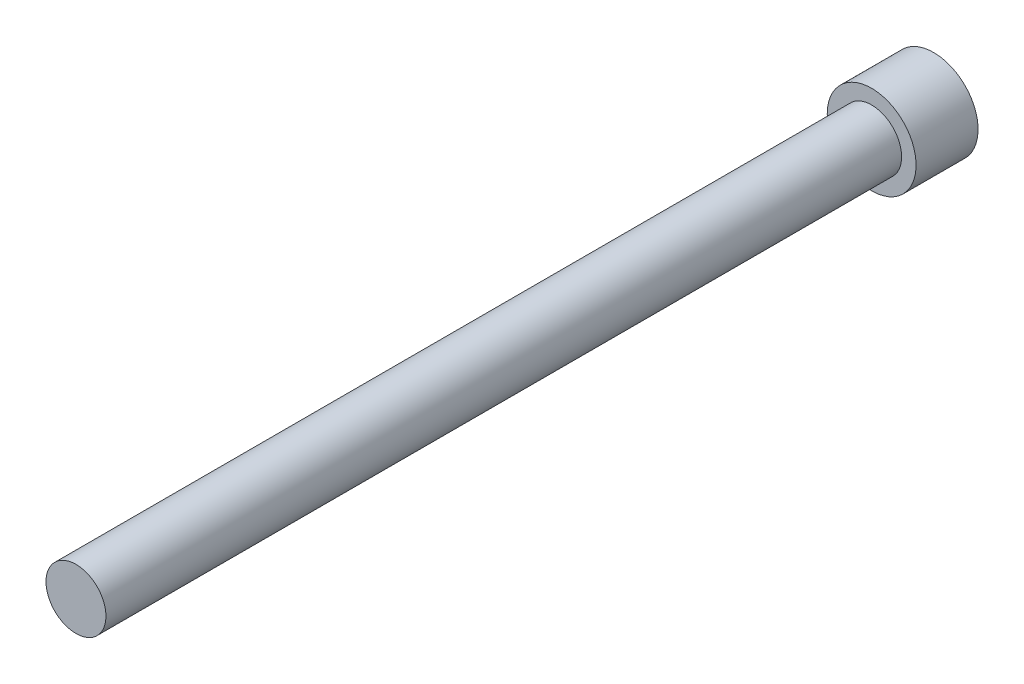
ISO-10303-21;
HEADER;
FILE_DESCRIPTION(('STEP AP214'),'2;1');
FILE_NAME('part.step','',(''),(''),'','','');
FILE_SCHEMA(('AUTOMOTIVE_DESIGN { 1 0 10303 214 1 1 1 1 }'));
ENDSEC;
DATA;
#1=APPLICATION_CONTEXT('core data for automotive mechanical design processes');
#2=APPLICATION_PROTOCOL_DEFINITION('international standard','automotive_design',2000,#1);
#3=PRODUCT_CONTEXT('',#1,'mechanical');
#4=PRODUCT('Part','Part','',(#3));
#5=PRODUCT_RELATED_PRODUCT_CATEGORY('part','',(#4));
#6=PRODUCT_DEFINITION_FORMATION('','',#4);
#7=PRODUCT_DEFINITION_CONTEXT('part definition',#1,'design');
#8=PRODUCT_DEFINITION('design','',#6,#7);
#9=PRODUCT_DEFINITION_SHAPE('','',#8);
#10=(LENGTH_UNIT() NAMED_UNIT(*) SI_UNIT(.MILLI.,.METRE.));
#11=(NAMED_UNIT(*) PLANE_ANGLE_UNIT() SI_UNIT($,.RADIAN.));
#12=(NAMED_UNIT(*) SI_UNIT($,.STERADIAN.) SOLID_ANGLE_UNIT());
#13=UNCERTAINTY_MEASURE_WITH_UNIT(LENGTH_MEASURE(1.E-05),#10,'distance_accuracy_value','');
#14=(GEOMETRIC_REPRESENTATION_CONTEXT(3) GLOBAL_UNCERTAINTY_ASSIGNED_CONTEXT((#13)) GLOBAL_UNIT_ASSIGNED_CONTEXT((#10,
#11,#12)) REPRESENTATION_CONTEXT('',''));
#15=CARTESIAN_POINT('',(0.,0.,0.));
#16=DIRECTION('',(0.,0.,1.));
#17=DIRECTION('',(1.,0.,0.));
#18=AXIS2_PLACEMENT_3D('',#15,#16,#17);
#19=CARTESIAN_POINT('',(0.,0.,41.5));
#20=DIRECTION('',(0.,0.,-1.));
#21=DIRECTION('',(-1.,0.,0.));
#22=AXIS2_PLACEMENT_3D('',#19,#20,#21);
#23=CYLINDRICAL_SURFACE('',#22,1.45);
#24=CARTESIAN_POINT('',(0.,0.,41.5));
#25=DIRECTION('',(0.,0.,1.));
#26=DIRECTION('',(1.,0.,0.));
#27=AXIS2_PLACEMENT_3D('',#24,#25,#26);
#28=CIRCLE('',#27,1.45);
#29=CARTESIAN_POINT('',(1.45,0.,41.5));
#30=VERTEX_POINT('',#29);
#31=EDGE_CURVE('E48',#30,#30,#28,.T.);
#32=ORIENTED_EDGE('',*,*,#31,.F.);
#33=EDGE_LOOP('',(#32));
#34=FACE_BOUND('',#33,.T.);
#35=CARTESIAN_POINT('',(0.,0.,3.));
#36=DIRECTION('',(0.,0.,-1.));
#37=DIRECTION('',(-1.,0.,0.));
#38=AXIS2_PLACEMENT_3D('',#35,#36,#37);
#39=CIRCLE('',#38,1.45);
#40=CARTESIAN_POINT('',(-1.45,0.,3.));
#41=VERTEX_POINT('',#40);
#42=EDGE_CURVE('E10',#41,#41,#39,.T.);
#43=ORIENTED_EDGE('',*,*,#42,.F.);
#44=EDGE_LOOP('',(#43));
#45=FACE_BOUND('',#44,.T.);
#46=ADVANCED_FACE('F41',(#34,#45),#23,.T.);
#47=CARTESIAN_POINT('',(0.,0.,41.5));
#48=DIRECTION('',(0.,0.,1.));
#49=DIRECTION('',(1.,0.,0.));
#50=AXIS2_PLACEMENT_3D('',#47,#48,#49);
#51=PLANE('',#50);
#52=ORIENTED_EDGE('',*,*,#31,.T.);
#53=EDGE_LOOP('',(#52));
#54=FACE_BOUND('',#53,.T.);
#55=ADVANCED_FACE('F70',(#54),#51,.T.);
#56=CARTESIAN_POINT('',(0.,0.,3.));
#57=DIRECTION('',(0.,0.,-1.));
#58=DIRECTION('',(-1.,0.,0.));
#59=AXIS2_PLACEMENT_3D('',#56,#57,#58);
#60=CYLINDRICAL_SURFACE('',#59,2.15);
#61=CARTESIAN_POINT('',(0.,0.,3.));
#62=DIRECTION('',(0.,0.,-1.));
#63=DIRECTION('',(-1.,0.,0.));
#64=AXIS2_PLACEMENT_3D('',#61,#62,#63);
#65=CIRCLE('',#64,2.15);
#66=CARTESIAN_POINT('',(-2.15,0.,3.));
#67=VERTEX_POINT('',#66);
#68=EDGE_CURVE('E53',#67,#67,#65,.T.);
#69=ORIENTED_EDGE('',*,*,#68,.T.);
#70=EDGE_LOOP('',(#69));
#71=FACE_BOUND('',#70,.T.);
#72=CARTESIAN_POINT('',(0.,0.,0.));
#73=DIRECTION('',(0.,0.,-1.));
#74=DIRECTION('',(-1.,0.,0.));
#75=AXIS2_PLACEMENT_3D('',#72,#73,#74);
#76=CIRCLE('',#75,2.15);
#77=CARTESIAN_POINT('',(-2.15,0.,0.));
#78=VERTEX_POINT('',#77);
#79=EDGE_CURVE('E58',#78,#78,#76,.T.);
#80=ORIENTED_EDGE('',*,*,#79,.F.);
#81=EDGE_LOOP('',(#80));
#82=FACE_BOUND('',#81,.T.);
#83=ADVANCED_FACE('F67',(#71,#82),#60,.T.);
#84=CARTESIAN_POINT('',(0.,0.,3.));
#85=DIRECTION('',(0.,0.,-1.));
#86=DIRECTION('',(-1.,0.,0.));
#87=AXIS2_PLACEMENT_3D('',#84,#85,#86);
#88=PLANE('',#87);
#89=ORIENTED_EDGE('',*,*,#42,.T.);
#90=EDGE_LOOP('',(#89));
#91=FACE_BOUND('',#90,.T.);
#92=ORIENTED_EDGE('',*,*,#68,.F.);
#93=EDGE_LOOP('',(#92));
#94=FACE_BOUND('',#93,.T.);
#95=ADVANCED_FACE('F69',(#91,#94),#88,.F.);
#96=CARTESIAN_POINT('',(0.,0.,0.));
#97=DIRECTION('',(0.,0.,1.));
#98=DIRECTION('',(1.,0.,0.));
#99=AXIS2_PLACEMENT_3D('',#96,#97,#98);
#100=PLANE('',#99);
#101=ORIENTED_EDGE('',*,*,#79,.T.);
#102=EDGE_LOOP('',(#101));
#103=FACE_BOUND('',#102,.T.);
#104=ADVANCED_FACE('F65',(#103),#100,.F.);
#105=CLOSED_SHELL('',(#46,#55,#83,#95,#104));
#106=MANIFOLD_SOLID_BREP('B2',#105);
#107=ADVANCED_BREP_SHAPE_REPRESENTATION('',(#18,#106),#14);
#108=SHAPE_DEFINITION_REPRESENTATION(#9,#107);
ENDSEC;
END-ISO-10303-21;
